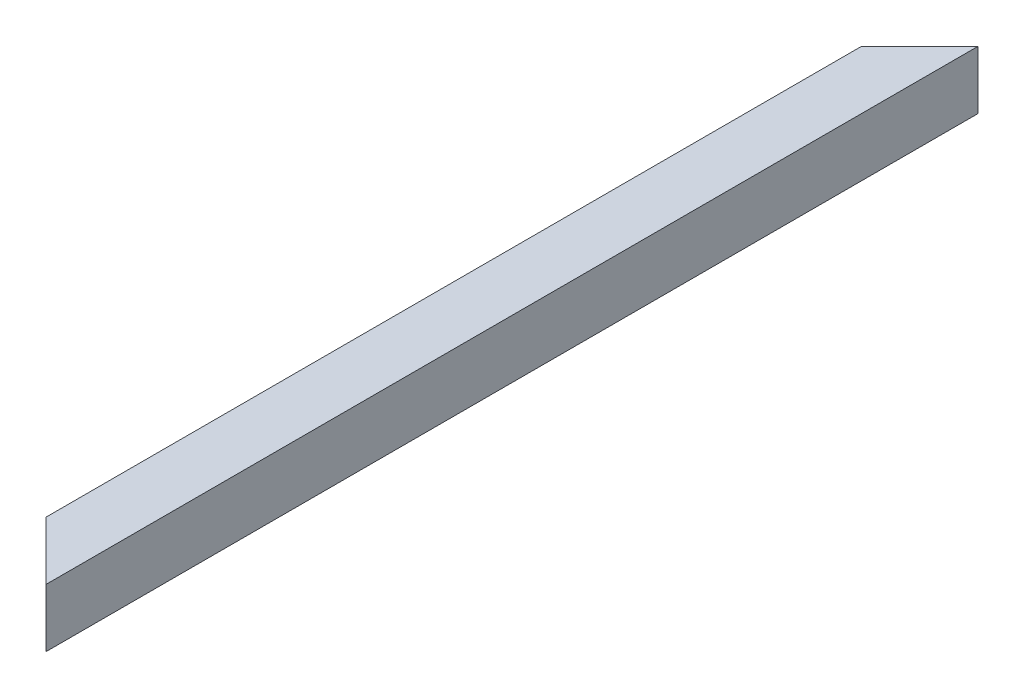
ISO-10303-21;
HEADER;
FILE_DESCRIPTION(('STEP AP214'),'2;1');
FILE_NAME('part.step','',(''),(''),'','','');
FILE_SCHEMA(('AUTOMOTIVE_DESIGN { 1 0 10303 214 1 1 1 1 }'));
ENDSEC;
DATA;
#1=APPLICATION_CONTEXT('core data for automotive mechanical design processes');
#2=APPLICATION_PROTOCOL_DEFINITION('international standard','automotive_design',2000,#1);
#3=PRODUCT_CONTEXT('',#1,'mechanical');
#4=PRODUCT('Part','Part','',(#3));
#5=PRODUCT_RELATED_PRODUCT_CATEGORY('part','',(#4));
#6=PRODUCT_DEFINITION_FORMATION('','',#4);
#7=PRODUCT_DEFINITION_CONTEXT('part definition',#1,'design');
#8=PRODUCT_DEFINITION('design','',#6,#7);
#9=PRODUCT_DEFINITION_SHAPE('','',#8);
#10=(LENGTH_UNIT() NAMED_UNIT(*) SI_UNIT(.MILLI.,.METRE.));
#11=(NAMED_UNIT(*) PLANE_ANGLE_UNIT() SI_UNIT($,.RADIAN.));
#12=(NAMED_UNIT(*) SI_UNIT($,.STERADIAN.) SOLID_ANGLE_UNIT());
#13=UNCERTAINTY_MEASURE_WITH_UNIT(LENGTH_MEASURE(1.E-05),#10,'distance_accuracy_value','');
#14=(GEOMETRIC_REPRESENTATION_CONTEXT(3) GLOBAL_UNCERTAINTY_ASSIGNED_CONTEXT((#13)) GLOBAL_UNIT_ASSIGNED_CONTEXT((#10,
#11,#12)) REPRESENTATION_CONTEXT('',''));
#15=CARTESIAN_POINT('',(0.,0.,0.));
#16=DIRECTION('',(0.,0.,1.));
#17=DIRECTION('',(1.,0.,0.));
#18=AXIS2_PLACEMENT_3D('',#15,#16,#17);
#19=CARTESIAN_POINT('',(165.,-10.,-2300.));
#20=DIRECTION('',(0.,1.,0.));
#21=DIRECTION('',(0.,0.,1.));
#22=AXIS2_PLACEMENT_3D('',#19,#20,#21);
#23=PLANE('',#22);
#24=DIRECTION('',(-0.707106781186548,0.,0.707106781186548));
#25=VECTOR('',#24,1.);
#26=CARTESIAN_POINT('',(170.,-10.,-2295.));
#27=LINE('',#26,#25);
#28=CARTESIAN_POINT('',(185.,-10.,-2310.));
#29=VERTEX_POINT('',#28);
#30=CARTESIAN_POINT('',(165.,-10.,-2290.));
#31=VERTEX_POINT('',#30);
#32=EDGE_CURVE('E166',#29,#31,#27,.T.);
#33=ORIENTED_EDGE('',*,*,#32,.F.);
#34=DIRECTION('',(0.,0.,1.));
#35=VECTOR('',#34,1.);
#36=CARTESIAN_POINT('',(185.,-10.,-2300.));
#37=LINE('',#36,#35);
#38=CARTESIAN_POINT('',(185.,-10.,-1990.));
#39=VERTEX_POINT('',#38);
#40=EDGE_CURVE('E53',#29,#39,#37,.T.);
#41=ORIENTED_EDGE('',*,*,#40,.T.);
#42=DIRECTION('',(0.707106781186548,0.,0.707106781186548));
#43=VECTOR('',#42,1.);
#44=CARTESIAN_POINT('',(20.,-10.,-2155.));
#45=LINE('',#44,#43);
#46=CARTESIAN_POINT('',(165.,-10.,-2010.));
#47=VERTEX_POINT('',#46);
#48=EDGE_CURVE('E128',#47,#39,#45,.T.);
#49=ORIENTED_EDGE('',*,*,#48,.F.);
#50=DIRECTION('',(0.,0.,1.));
#51=VECTOR('',#50,1.);
#52=CARTESIAN_POINT('',(165.,-10.,-2300.));
#53=LINE('',#52,#51);
#54=EDGE_CURVE('E132',#31,#47,#53,.T.);
#55=ORIENTED_EDGE('',*,*,#54,.F.);
#56=EDGE_LOOP('',(#33,#41,#49,#55));
#57=FACE_BOUND('',#56,.T.);
#58=ADVANCED_FACE('F39',(#57),#23,.F.);
#59=CARTESIAN_POINT('',(165.,-10.,-2300.));
#60=DIRECTION('',(1.,0.,0.));
#61=DIRECTION('',(0.,0.,-1.));
#62=AXIS2_PLACEMENT_3D('',#59,#60,#61);
#63=PLANE('',#62);
#64=DIRECTION('',(0.,1.,0.));
#65=VECTOR('',#64,1.);
#66=CARTESIAN_POINT('',(165.,-10.,-2290.));
#67=LINE('',#66,#65);
#68=CARTESIAN_POINT('',(165.,10.,-2290.));
#69=VERTEX_POINT('',#68);
#70=EDGE_CURVE('E163',#31,#69,#67,.T.);
#71=ORIENTED_EDGE('',*,*,#70,.F.);
#72=ORIENTED_EDGE('',*,*,#54,.T.);
#73=DIRECTION('',(0.,-1.,0.));
#74=VECTOR('',#73,1.);
#75=CARTESIAN_POINT('',(165.,-10.,-2010.));
#76=LINE('',#75,#74);
#77=CARTESIAN_POINT('',(165.,10.,-2010.));
#78=VERTEX_POINT('',#77);
#79=EDGE_CURVE('E142',#78,#47,#76,.T.);
#80=ORIENTED_EDGE('',*,*,#79,.F.);
#81=DIRECTION('',(0.,0.,1.));
#82=VECTOR('',#81,1.);
#83=CARTESIAN_POINT('',(165.,10.,-2300.));
#84=LINE('',#83,#82);
#85=EDGE_CURVE('E130',#69,#78,#84,.T.);
#86=ORIENTED_EDGE('',*,*,#85,.F.);
#87=EDGE_LOOP('',(#71,#72,#80,#86));
#88=FACE_BOUND('',#87,.T.);
#89=ADVANCED_FACE('F185',(#88),#63,.F.);
#90=CARTESIAN_POINT('',(165.,10.,-2300.));
#91=DIRECTION('',(0.,-1.,0.));
#92=DIRECTION('',(0.,0.,-1.));
#93=AXIS2_PLACEMENT_3D('',#90,#91,#92);
#94=PLANE('',#93);
#95=DIRECTION('',(0.707106781186548,0.,-0.707106781186548));
#96=VECTOR('',#95,1.);
#97=CARTESIAN_POINT('',(170.,10.,-2295.));
#98=LINE('',#97,#96);
#99=CARTESIAN_POINT('',(185.,10.,-2310.));
#100=VERTEX_POINT('',#99);
#101=EDGE_CURVE('E160',#69,#100,#98,.T.);
#102=ORIENTED_EDGE('',*,*,#101,.F.);
#103=ORIENTED_EDGE('',*,*,#85,.T.);
#104=DIRECTION('',(-0.707106781186548,0.,-0.707106781186548));
#105=VECTOR('',#104,1.);
#106=CARTESIAN_POINT('',(20.,10.,-2155.));
#107=LINE('',#106,#105);
#108=CARTESIAN_POINT('',(185.,10.,-1990.));
#109=VERTEX_POINT('',#108);
#110=EDGE_CURVE('E145',#109,#78,#107,.T.);
#111=ORIENTED_EDGE('',*,*,#110,.F.);
#112=DIRECTION('',(0.,0.,1.));
#113=VECTOR('',#112,1.);
#114=CARTESIAN_POINT('',(185.,10.,-2300.));
#115=LINE('',#114,#113);
#116=EDGE_CURVE('E127',#100,#109,#115,.T.);
#117=ORIENTED_EDGE('',*,*,#116,.F.);
#118=EDGE_LOOP('',(#102,#103,#111,#117));
#119=FACE_BOUND('',#118,.T.);
#120=ADVANCED_FACE('F189',(#119),#94,.F.);
#121=CARTESIAN_POINT('',(185.,-10.,-2300.));
#122=DIRECTION('',(-1.,0.,0.));
#123=DIRECTION('',(0.,0.,1.));
#124=AXIS2_PLACEMENT_3D('',#121,#122,#123);
#125=PLANE('',#124);
#126=DIRECTION('',(0.,-1.,0.));
#127=VECTOR('',#126,1.);
#128=CARTESIAN_POINT('',(185.,-10.,-2310.));
#129=LINE('',#128,#127);
#130=EDGE_CURVE('E157',#100,#29,#129,.T.);
#131=ORIENTED_EDGE('',*,*,#130,.F.);
#132=ORIENTED_EDGE('',*,*,#116,.T.);
#133=DIRECTION('',(0.,1.,0.));
#134=VECTOR('',#133,1.);
#135=CARTESIAN_POINT('',(185.,-10.,-1990.));
#136=LINE('',#135,#134);
#137=EDGE_CURVE('E148',#39,#109,#136,.T.);
#138=ORIENTED_EDGE('',*,*,#137,.F.);
#139=ORIENTED_EDGE('',*,*,#40,.F.);
#140=EDGE_LOOP('',(#131,#132,#138,#139));
#141=FACE_BOUND('',#140,.T.);
#142=ADVANCED_FACE('F181',(#141),#125,.F.);
#143=CARTESIAN_POINT('',(175.,0.,-2000.));
#144=DIRECTION('',(-0.707106781186548,0.,0.707106781186548));
#145=DIRECTION('',(0.707106781186548,0.,0.707106781186548));
#146=AXIS2_PLACEMENT_3D('',#143,#144,#145);
#147=PLANE('',#146);
#148=DIRECTION('',(0.,1.,0.));
#149=VECTOR('',#148,1.);
#150=CARTESIAN_POINT('',(183.4,-8.40000000000002,-1991.6));
#151=LINE('',#150,#149);
#152=CARTESIAN_POINT('',(183.4,-8.40000000000002,-1991.6));
#153=VERTEX_POINT('',#152);
#154=CARTESIAN_POINT('',(183.4,8.39999999999999,-1991.6));
#155=VERTEX_POINT('',#154);
#156=EDGE_CURVE('E119',#153,#155,#151,.T.);
#157=ORIENTED_EDGE('',*,*,#156,.F.);
#158=DIRECTION('',(0.707106781186548,0.,0.707106781186548));
#159=VECTOR('',#158,1.);
#160=CARTESIAN_POINT('',(20.8,-8.39999999999975,-2154.2));
#161=LINE('',#160,#159);
#162=CARTESIAN_POINT('',(166.6,-8.39999999999999,-2008.4));
#163=VERTEX_POINT('',#162);
#164=EDGE_CURVE('E46',#163,#153,#161,.T.);
#165=ORIENTED_EDGE('',*,*,#164,.F.);
#166=DIRECTION('',(0.,-1.,0.));
#167=VECTOR('',#166,1.);
#168=CARTESIAN_POINT('',(166.6,-8.39999999999999,-2008.4));
#169=LINE('',#168,#167);
#170=CARTESIAN_POINT('',(166.6,8.39999999999999,-2008.4));
#171=VERTEX_POINT('',#170);
#172=EDGE_CURVE('E154',#171,#163,#169,.T.);
#173=ORIENTED_EDGE('',*,*,#172,.F.);
#174=DIRECTION('',(-0.707106781186548,0.,-0.707106781186548));
#175=VECTOR('',#174,1.);
#176=CARTESIAN_POINT('',(20.8,8.39999999999999,-2154.2));
#177=LINE('',#176,#175);
#178=EDGE_CURVE('E152',#155,#171,#177,.T.);
#179=ORIENTED_EDGE('',*,*,#178,.F.);
#180=EDGE_LOOP('',(#157,#165,#173,#179));
#181=FACE_BOUND('',#180,.T.);
#182=ORIENTED_EDGE('',*,*,#79,.T.);
#183=ORIENTED_EDGE('',*,*,#48,.T.);
#184=ORIENTED_EDGE('',*,*,#137,.T.);
#185=ORIENTED_EDGE('',*,*,#110,.T.);
#186=EDGE_LOOP('',(#182,#183,#184,#185));
#187=FACE_BOUND('',#186,.T.);
#188=ADVANCED_FACE('F178',(#181,#187),#147,.T.);
#189=CARTESIAN_POINT('',(183.4,-8.40000000000002,-2300.));
#190=DIRECTION('',(-1.,0.,0.));
#191=DIRECTION('',(0.,0.,1.));
#192=AXIS2_PLACEMENT_3D('',#189,#190,#191);
#193=PLANE('',#192);
#194=DIRECTION('',(0.,0.,1.));
#195=VECTOR('',#194,1.);
#196=CARTESIAN_POINT('',(183.4,8.39999999999999,-2300.));
#197=LINE('',#196,#195);
#198=CARTESIAN_POINT('',(183.4,8.39999999999999,-2308.4));
#199=VERTEX_POINT('',#198);
#200=EDGE_CURVE('E110',#199,#155,#197,.T.);
#201=ORIENTED_EDGE('',*,*,#200,.F.);
#202=DIRECTION('',(0.,-1.,0.));
#203=VECTOR('',#202,1.);
#204=CARTESIAN_POINT('',(183.4,-8.40000000000002,-2308.4));
#205=LINE('',#204,#203);
#206=CARTESIAN_POINT('',(183.4,-8.40000000000002,-2308.4));
#207=VERTEX_POINT('',#206);
#208=EDGE_CURVE('E11',#199,#207,#205,.T.);
#209=ORIENTED_EDGE('',*,*,#208,.T.);
#210=DIRECTION('',(0.,0.,1.));
#211=VECTOR('',#210,1.);
#212=CARTESIAN_POINT('',(183.4,-8.40000000000002,-2300.));
#213=LINE('',#212,#211);
#214=EDGE_CURVE('E133',#207,#153,#213,.T.);
#215=ORIENTED_EDGE('',*,*,#214,.T.);
#216=ORIENTED_EDGE('',*,*,#156,.T.);
#217=EDGE_LOOP('',(#201,#209,#215,#216));
#218=FACE_BOUND('',#217,.T.);
#219=ADVANCED_FACE('F117',(#218),#193,.T.);
#220=CARTESIAN_POINT('',(166.6,8.39999999999999,-2300.));
#221=DIRECTION('',(0.,-1.,0.));
#222=DIRECTION('',(0.,0.,-1.));
#223=AXIS2_PLACEMENT_3D('',#220,#221,#222);
#224=PLANE('',#223);
#225=DIRECTION('',(0.,0.,1.));
#226=VECTOR('',#225,1.);
#227=CARTESIAN_POINT('',(166.6,8.39999999999999,-2300.));
#228=LINE('',#227,#226);
#229=CARTESIAN_POINT('',(166.6,8.39999999999999,-2291.6));
#230=VERTEX_POINT('',#229);
#231=EDGE_CURVE('E112',#230,#171,#228,.T.);
#232=ORIENTED_EDGE('',*,*,#231,.F.);
#233=DIRECTION('',(0.707106781186548,0.,-0.707106781186548));
#234=VECTOR('',#233,1.);
#235=CARTESIAN_POINT('',(170.8,8.39999999999999,-2295.8));
#236=LINE('',#235,#234);
#237=EDGE_CURVE('E103',#230,#199,#236,.T.);
#238=ORIENTED_EDGE('',*,*,#237,.T.);
#239=ORIENTED_EDGE('',*,*,#200,.T.);
#240=ORIENTED_EDGE('',*,*,#178,.T.);
#241=EDGE_LOOP('',(#232,#238,#239,#240));
#242=FACE_BOUND('',#241,.T.);
#243=ADVANCED_FACE('F108',(#242),#224,.T.);
#244=CARTESIAN_POINT('',(166.6,-8.39999999999999,-2300.));
#245=DIRECTION('',(1.,0.,0.));
#246=DIRECTION('',(0.,0.,-1.));
#247=AXIS2_PLACEMENT_3D('',#244,#245,#246);
#248=PLANE('',#247);
#249=DIRECTION('',(0.,0.,1.));
#250=VECTOR('',#249,1.);
#251=CARTESIAN_POINT('',(166.6,-8.39999999999999,-2300.));
#252=LINE('',#251,#250);
#253=CARTESIAN_POINT('',(166.6,-8.39999999999999,-2291.6));
#254=VERTEX_POINT('',#253);
#255=EDGE_CURVE('E122',#254,#163,#252,.T.);
#256=ORIENTED_EDGE('',*,*,#255,.F.);
#257=DIRECTION('',(0.,1.,0.));
#258=VECTOR('',#257,1.);
#259=CARTESIAN_POINT('',(166.6,-8.39999999999999,-2291.6));
#260=LINE('',#259,#258);
#261=EDGE_CURVE('E114',#254,#230,#260,.T.);
#262=ORIENTED_EDGE('',*,*,#261,.T.);
#263=ORIENTED_EDGE('',*,*,#231,.T.);
#264=ORIENTED_EDGE('',*,*,#172,.T.);
#265=EDGE_LOOP('',(#256,#262,#263,#264));
#266=FACE_BOUND('',#265,.T.);
#267=ADVANCED_FACE('F172',(#266),#248,.T.);
#268=CARTESIAN_POINT('',(166.6,-8.39999999999999,-2300.));
#269=DIRECTION('',(0.,1.,0.));
#270=DIRECTION('',(-1.,0.,0.));
#271=AXIS2_PLACEMENT_3D('',#268,#269,#270);
#272=PLANE('',#271);
#273=ORIENTED_EDGE('',*,*,#214,.F.);
#274=DIRECTION('',(-0.707106781186548,0.,0.707106781186548));
#275=VECTOR('',#274,1.);
#276=CARTESIAN_POINT('',(170.8,-8.4,-2295.8));
#277=LINE('',#276,#275);
#278=EDGE_CURVE('E61',#207,#254,#277,.T.);
#279=ORIENTED_EDGE('',*,*,#278,.T.);
#280=ORIENTED_EDGE('',*,*,#255,.T.);
#281=ORIENTED_EDGE('',*,*,#164,.T.);
#282=EDGE_LOOP('',(#273,#279,#280,#281));
#283=FACE_BOUND('',#282,.T.);
#284=ADVANCED_FACE('F176',(#283),#272,.T.);
#285=CARTESIAN_POINT('',(175.,0.,-2300.));
#286=DIRECTION('',(-0.707106781186548,0.,-0.707106781186548));
#287=DIRECTION('',(-0.707106781186548,0.,0.707106781186548));
#288=AXIS2_PLACEMENT_3D('',#285,#286,#287);
#289=PLANE('',#288);
#290=ORIENTED_EDGE('',*,*,#278,.F.);
#291=ORIENTED_EDGE('',*,*,#208,.F.);
#292=ORIENTED_EDGE('',*,*,#237,.F.);
#293=ORIENTED_EDGE('',*,*,#261,.F.);
#294=EDGE_LOOP('',(#290,#291,#292,#293));
#295=FACE_BOUND('',#294,.T.);
#296=ORIENTED_EDGE('',*,*,#101,.T.);
#297=ORIENTED_EDGE('',*,*,#130,.T.);
#298=ORIENTED_EDGE('',*,*,#32,.T.);
#299=ORIENTED_EDGE('',*,*,#70,.T.);
#300=EDGE_LOOP('',(#296,#297,#298,#299));
#301=FACE_BOUND('',#300,.T.);
#302=ADVANCED_FACE('F101',(#295,#301),#289,.T.);
#303=CLOSED_SHELL('',(#58,#89,#120,#142,#188,#219,#243,#267,#284,#302));
#304=MANIFOLD_SOLID_BREP('B2',#303);
#305=ADVANCED_BREP_SHAPE_REPRESENTATION('',(#18,#304),#14);
#306=SHAPE_DEFINITION_REPRESENTATION(#9,#305);
ENDSEC;
END-ISO-10303-21;
